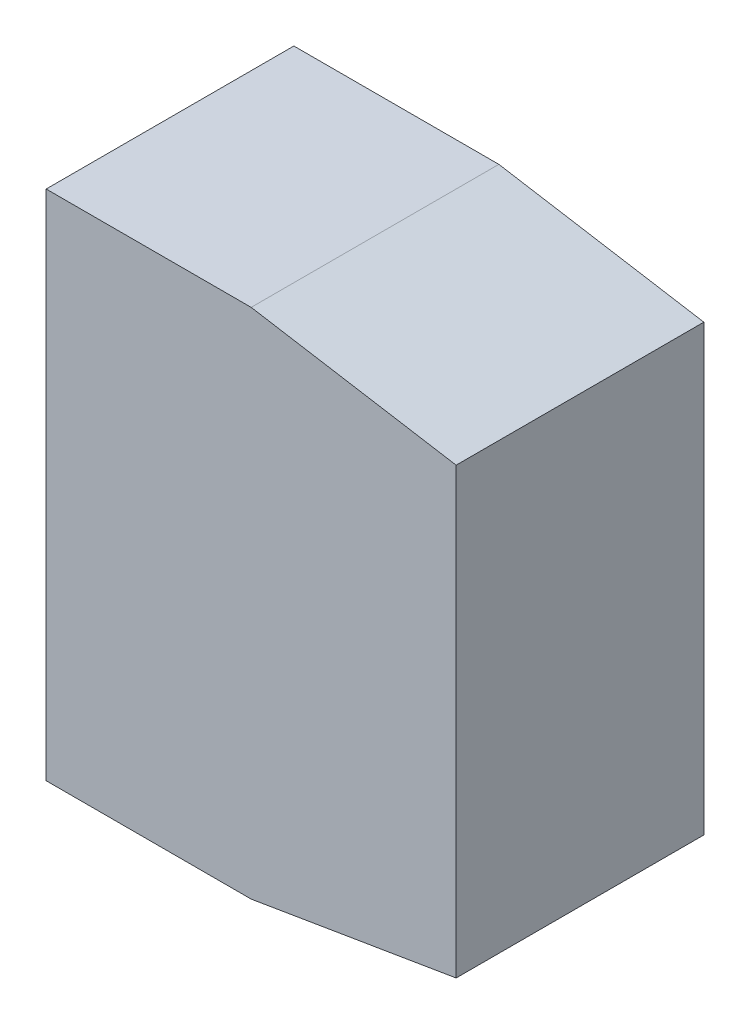
ISO-10303-21;
HEADER;
FILE_DESCRIPTION(('STEP AP214'),'2;1');
FILE_NAME('part.step','',(''),(''),'','','');
FILE_SCHEMA(('AUTOMOTIVE_DESIGN { 1 0 10303 214 1 1 1 1 }'));
ENDSEC;
DATA;
#1=APPLICATION_CONTEXT('core data for automotive mechanical design processes');
#2=APPLICATION_PROTOCOL_DEFINITION('international standard','automotive_design',2000,#1);
#3=PRODUCT_CONTEXT('',#1,'mechanical');
#4=PRODUCT('Part','Part','',(#3));
#5=PRODUCT_RELATED_PRODUCT_CATEGORY('part','',(#4));
#6=PRODUCT_DEFINITION_FORMATION('','',#4);
#7=PRODUCT_DEFINITION_CONTEXT('part definition',#1,'design');
#8=PRODUCT_DEFINITION('design','',#6,#7);
#9=PRODUCT_DEFINITION_SHAPE('','',#8);
#10=(LENGTH_UNIT() NAMED_UNIT(*) SI_UNIT(.MILLI.,.METRE.));
#11=(NAMED_UNIT(*) PLANE_ANGLE_UNIT() SI_UNIT($,.RADIAN.));
#12=(NAMED_UNIT(*) SI_UNIT($,.STERADIAN.) SOLID_ANGLE_UNIT());
#13=UNCERTAINTY_MEASURE_WITH_UNIT(LENGTH_MEASURE(1.E-05),#10,'distance_accuracy_value','');
#14=(GEOMETRIC_REPRESENTATION_CONTEXT(3) GLOBAL_UNCERTAINTY_ASSIGNED_CONTEXT((#13)) GLOBAL_UNIT_ASSIGNED_CONTEXT((#10,
#11,#12)) REPRESENTATION_CONTEXT('',''));
#15=CARTESIAN_POINT('',(0.,0.,0.));
#16=DIRECTION('',(0.,0.,1.));
#17=DIRECTION('',(1.,0.,0.));
#18=AXIS2_PLACEMENT_3D('',#15,#16,#17);
#19=CARTESIAN_POINT('',(0.,0.,-7.25));
#20=DIRECTION('',(0.,0.,-1.));
#21=DIRECTION('',(-1.,0.,0.));
#22=AXIS2_PLACEMENT_3D('',#19,#20,#21);
#23=PLANE('',#22);
#24=DIRECTION('',(0.,1.,0.));
#25=VECTOR('',#24,1.);
#26=CARTESIAN_POINT('',(24.,28.,-7.25));
#27=LINE('',#26,#25);
#28=CARTESIAN_POINT('',(24.,28.,-7.25));
#29=VERTEX_POINT('',#28);
#30=CARTESIAN_POINT('',(24.,2.,-7.25));
#31=VERTEX_POINT('',#30);
#32=EDGE_CURVE('E92',#29,#31,#27,.F.);
#33=ORIENTED_EDGE('',*,*,#32,.T.);
#34=DIRECTION('',(-0.986393923832144,-0.164398987305357,0.));
#35=VECTOR('',#34,1.);
#36=CARTESIAN_POINT('',(24.,2.,-7.25));
#37=LINE('',#36,#35);
#38=CARTESIAN_POINT('',(12.,0.,-7.25));
#39=VERTEX_POINT('',#38);
#40=EDGE_CURVE('E97',#31,#39,#37,.T.);
#41=ORIENTED_EDGE('',*,*,#40,.T.);
#42=DIRECTION('',(-1.,0.,0.));
#43=VECTOR('',#42,1.);
#44=CARTESIAN_POINT('',(12.,0.,-7.25));
#45=LINE('',#44,#43);
#46=CARTESIAN_POINT('',(0.,0.,-7.25));
#47=VERTEX_POINT('',#46);
#48=EDGE_CURVE('E69',#39,#47,#45,.T.);
#49=ORIENTED_EDGE('',*,*,#48,.T.);
#50=DIRECTION('',(0.,1.,0.));
#51=VECTOR('',#50,1.);
#52=CARTESIAN_POINT('',(0.,0.,-7.25));
#53=LINE('',#52,#51);
#54=CARTESIAN_POINT('',(0.,30.,-7.25));
#55=VERTEX_POINT('',#54);
#56=EDGE_CURVE('E19',#47,#55,#53,.T.);
#57=ORIENTED_EDGE('',*,*,#56,.T.);
#58=DIRECTION('',(1.,0.,0.));
#59=VECTOR('',#58,1.);
#60=CARTESIAN_POINT('',(0.,30.,-7.25));
#61=LINE('',#60,#59);
#62=CARTESIAN_POINT('',(12.,30.,-7.25));
#63=VERTEX_POINT('',#62);
#64=EDGE_CURVE('E66',#55,#63,#61,.T.);
#65=ORIENTED_EDGE('',*,*,#64,.T.);
#66=DIRECTION('',(0.986393923832144,-0.164398987305357,0.));
#67=VECTOR('',#66,1.);
#68=CARTESIAN_POINT('',(12.,30.,-7.25));
#69=LINE('',#68,#67);
#70=EDGE_CURVE('E87',#63,#29,#69,.T.);
#71=ORIENTED_EDGE('',*,*,#70,.T.);
#72=EDGE_LOOP('',(#33,#41,#49,#57,#65,#71));
#73=FACE_BOUND('',#72,.T.);
#74=ADVANCED_FACE('F16',(#73),#23,.T.);
#75=CARTESIAN_POINT('',(0.,0.,7.25));
#76=DIRECTION('',(1.,0.,0.));
#77=DIRECTION('',(0.,0.,-1.));
#78=AXIS2_PLACEMENT_3D('',#75,#76,#77);
#79=PLANE('',#78);
#80=DIRECTION('',(0.,0.,1.));
#81=VECTOR('',#80,1.);
#82=CARTESIAN_POINT('',(0.,0.,7.25));
#83=LINE('',#82,#81);
#84=CARTESIAN_POINT('',(0.,0.,7.25));
#85=VERTEX_POINT('',#84);
#86=EDGE_CURVE('E99',#47,#85,#83,.T.);
#87=ORIENTED_EDGE('',*,*,#86,.T.);
#88=DIRECTION('',(0.,1.,0.));
#89=VECTOR('',#88,1.);
#90=CARTESIAN_POINT('',(0.,0.,7.25));
#91=LINE('',#90,#89);
#92=CARTESIAN_POINT('',(0.,30.,7.25));
#93=VERTEX_POINT('',#92);
#94=EDGE_CURVE('E84',#85,#93,#91,.T.);
#95=ORIENTED_EDGE('',*,*,#94,.T.);
#96=DIRECTION('',(0.,0.,-1.));
#97=VECTOR('',#96,1.);
#98=CARTESIAN_POINT('',(0.,30.,7.25));
#99=LINE('',#98,#97);
#100=EDGE_CURVE('E74',#93,#55,#99,.T.);
#101=ORIENTED_EDGE('',*,*,#100,.T.);
#102=ORIENTED_EDGE('',*,*,#56,.F.);
#103=EDGE_LOOP('',(#87,#95,#101,#102));
#104=FACE_BOUND('',#103,.T.);
#105=ADVANCED_FACE('F83',(#104),#79,.F.);
#106=CARTESIAN_POINT('',(0.,30.,7.25));
#107=DIRECTION('',(0.,-1.,0.));
#108=DIRECTION('',(0.,0.,-1.));
#109=AXIS2_PLACEMENT_3D('',#106,#107,#108);
#110=PLANE('',#109);
#111=ORIENTED_EDGE('',*,*,#100,.F.);
#112=DIRECTION('',(-1.,0.,0.));
#113=VECTOR('',#112,1.);
#114=CARTESIAN_POINT('',(0.,30.,7.25));
#115=LINE('',#114,#113);
#116=CARTESIAN_POINT('',(12.,30.,7.25));
#117=VERTEX_POINT('',#116);
#118=EDGE_CURVE('E104',#93,#117,#115,.F.);
#119=ORIENTED_EDGE('',*,*,#118,.T.);
#120=DIRECTION('',(0.,0.,1.));
#121=VECTOR('',#120,1.);
#122=CARTESIAN_POINT('',(12.,30.,7.25));
#123=LINE('',#122,#121);
#124=EDGE_CURVE('E80',#117,#63,#123,.F.);
#125=ORIENTED_EDGE('',*,*,#124,.T.);
#126=ORIENTED_EDGE('',*,*,#64,.F.);
#127=EDGE_LOOP('',(#111,#119,#125,#126));
#128=FACE_BOUND('',#127,.T.);
#129=ADVANCED_FACE('F77',(#128),#110,.F.);
#130=CARTESIAN_POINT('',(12.,30.,7.25));
#131=DIRECTION('',(-0.164398987305357,-0.986393923832144,0.));
#132=DIRECTION('',(0.986393923832144,-0.164398987305357,0.));
#133=AXIS2_PLACEMENT_3D('',#130,#131,#132);
#134=PLANE('',#133);
#135=ORIENTED_EDGE('',*,*,#124,.F.);
#136=DIRECTION('',(0.986393923832144,-0.164398987305357,0.));
#137=VECTOR('',#136,1.);
#138=CARTESIAN_POINT('',(12.,30.,7.25));
#139=LINE('',#138,#137);
#140=CARTESIAN_POINT('',(24.,28.,7.25));
#141=VERTEX_POINT('',#140);
#142=EDGE_CURVE('E106',#117,#141,#139,.T.);
#143=ORIENTED_EDGE('',*,*,#142,.T.);
#144=DIRECTION('',(0.,0.,1.));
#145=VECTOR('',#144,1.);
#146=CARTESIAN_POINT('',(24.,28.,7.25));
#147=LINE('',#146,#145);
#148=EDGE_CURVE('E89',#141,#29,#147,.F.);
#149=ORIENTED_EDGE('',*,*,#148,.T.);
#150=ORIENTED_EDGE('',*,*,#70,.F.);
#151=EDGE_LOOP('',(#135,#143,#149,#150));
#152=FACE_BOUND('',#151,.T.);
#153=ADVANCED_FACE('F125',(#152),#134,.F.);
#154=CARTESIAN_POINT('',(24.,28.,7.25));
#155=DIRECTION('',(-1.,0.,0.));
#156=DIRECTION('',(0.,0.,1.));
#157=AXIS2_PLACEMENT_3D('',#154,#155,#156);
#158=PLANE('',#157);
#159=ORIENTED_EDGE('',*,*,#148,.F.);
#160=DIRECTION('',(0.,1.,0.));
#161=VECTOR('',#160,1.);
#162=CARTESIAN_POINT('',(24.,0.,7.25));
#163=LINE('',#162,#161);
#164=CARTESIAN_POINT('',(24.,2.,7.25));
#165=VERTEX_POINT('',#164);
#166=EDGE_CURVE('E109',#141,#165,#163,.F.);
#167=ORIENTED_EDGE('',*,*,#166,.T.);
#168=DIRECTION('',(0.,0.,1.));
#169=VECTOR('',#168,1.);
#170=CARTESIAN_POINT('',(24.,2.,7.25));
#171=LINE('',#170,#169);
#172=EDGE_CURVE('E94',#165,#31,#171,.F.);
#173=ORIENTED_EDGE('',*,*,#172,.T.);
#174=ORIENTED_EDGE('',*,*,#32,.F.);
#175=EDGE_LOOP('',(#159,#167,#173,#174));
#176=FACE_BOUND('',#175,.T.);
#177=ADVANCED_FACE('F122',(#176),#158,.F.);
#178=CARTESIAN_POINT('',(24.,2.,7.25));
#179=DIRECTION('',(-0.164398987305357,0.986393923832144,0.));
#180=DIRECTION('',(-0.986393923832144,-0.164398987305357,0.));
#181=AXIS2_PLACEMENT_3D('',#178,#179,#180);
#182=PLANE('',#181);
#183=ORIENTED_EDGE('',*,*,#172,.F.);
#184=DIRECTION('',(-0.986393923832144,-0.164398987305357,0.));
#185=VECTOR('',#184,1.);
#186=CARTESIAN_POINT('',(24.,2.,7.25));
#187=LINE('',#186,#185);
#188=CARTESIAN_POINT('',(12.,0.,7.25));
#189=VERTEX_POINT('',#188);
#190=EDGE_CURVE('E25',#165,#189,#187,.T.);
#191=ORIENTED_EDGE('',*,*,#190,.T.);
#192=DIRECTION('',(0.,0.,1.));
#193=VECTOR('',#192,1.);
#194=CARTESIAN_POINT('',(12.,0.,7.25));
#195=LINE('',#194,#193);
#196=EDGE_CURVE('E33',#189,#39,#195,.F.);
#197=ORIENTED_EDGE('',*,*,#196,.T.);
#198=ORIENTED_EDGE('',*,*,#40,.F.);
#199=EDGE_LOOP('',(#183,#191,#197,#198));
#200=FACE_BOUND('',#199,.T.);
#201=ADVANCED_FACE('F115',(#200),#182,.F.);
#202=CARTESIAN_POINT('',(12.,0.,7.25));
#203=DIRECTION('',(0.,1.,0.));
#204=DIRECTION('',(-1.,0.,0.));
#205=AXIS2_PLACEMENT_3D('',#202,#203,#204);
#206=PLANE('',#205);
#207=ORIENTED_EDGE('',*,*,#196,.F.);
#208=DIRECTION('',(-1.,0.,0.));
#209=VECTOR('',#208,1.);
#210=CARTESIAN_POINT('',(0.,0.,7.25));
#211=LINE('',#210,#209);
#212=EDGE_CURVE('E11',#189,#85,#211,.T.);
#213=ORIENTED_EDGE('',*,*,#212,.T.);
#214=ORIENTED_EDGE('',*,*,#86,.F.);
#215=ORIENTED_EDGE('',*,*,#48,.F.);
#216=EDGE_LOOP('',(#207,#213,#214,#215));
#217=FACE_BOUND('',#216,.T.);
#218=ADVANCED_FACE('F126',(#217),#206,.F.);
#219=CARTESIAN_POINT('',(0.,0.,7.25));
#220=DIRECTION('',(0.,0.,-1.));
#221=DIRECTION('',(-1.,0.,0.));
#222=AXIS2_PLACEMENT_3D('',#219,#220,#221);
#223=PLANE('',#222);
#224=ORIENTED_EDGE('',*,*,#190,.F.);
#225=ORIENTED_EDGE('',*,*,#166,.F.);
#226=ORIENTED_EDGE('',*,*,#142,.F.);
#227=ORIENTED_EDGE('',*,*,#118,.F.);
#228=ORIENTED_EDGE('',*,*,#94,.F.);
#229=ORIENTED_EDGE('',*,*,#212,.F.);
#230=EDGE_LOOP('',(#224,#225,#226,#227,#228,#229));
#231=FACE_BOUND('',#230,.T.);
#232=ADVANCED_FACE('F119',(#231),#223,.F.);
#233=CLOSED_SHELL('',(#74,#105,#129,#153,#177,#201,#218,#232));
#234=MANIFOLD_SOLID_BREP('B1',#233);
#235=ADVANCED_BREP_SHAPE_REPRESENTATION('',(#18,#234),#14);
#236=SHAPE_DEFINITION_REPRESENTATION(#9,#235);
ENDSEC;
END-ISO-10303-21;
